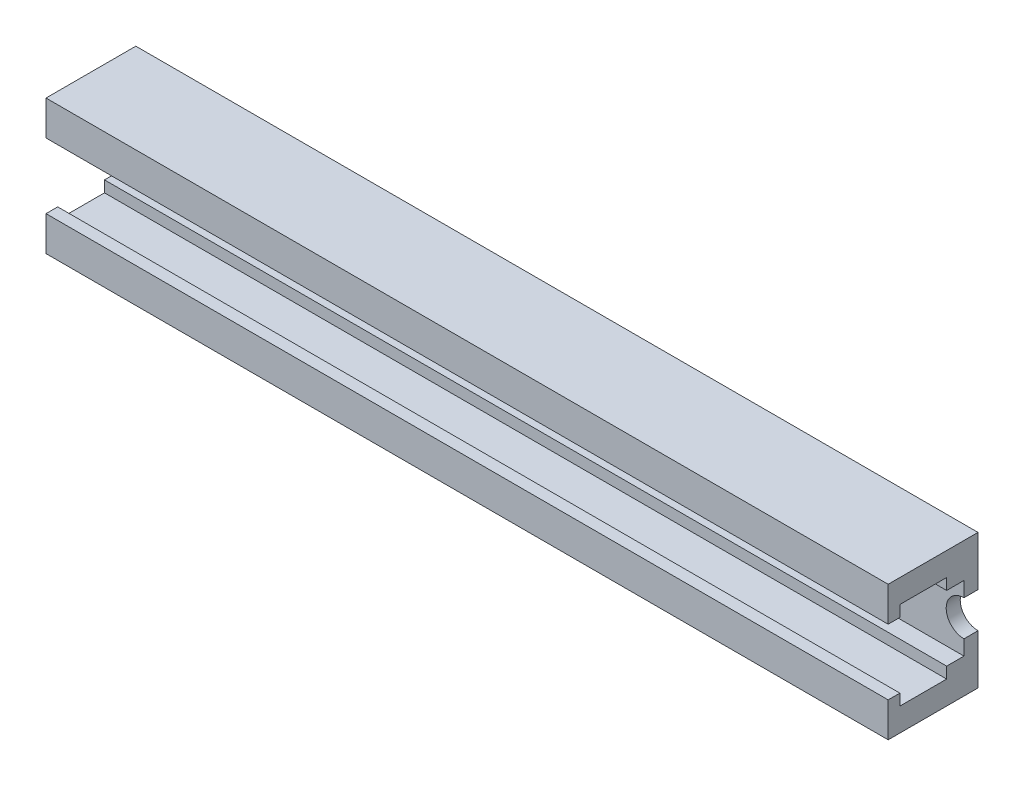
ISO-10303-21;
HEADER;
FILE_DESCRIPTION(('STEP AP214'),'2;1');
FILE_NAME('part.step','',(''),(''),'','','');
FILE_SCHEMA(('AUTOMOTIVE_DESIGN { 1 0 10303 214 1 1 1 1 }'));
ENDSEC;
DATA;
#1=APPLICATION_CONTEXT('core data for automotive mechanical design processes');
#2=APPLICATION_PROTOCOL_DEFINITION('international standard','automotive_design',2000,#1);
#3=PRODUCT_CONTEXT('',#1,'mechanical');
#4=PRODUCT('Part','Part','',(#3));
#5=PRODUCT_RELATED_PRODUCT_CATEGORY('part','',(#4));
#6=PRODUCT_DEFINITION_FORMATION('','',#4);
#7=PRODUCT_DEFINITION_CONTEXT('part definition',#1,'design');
#8=PRODUCT_DEFINITION('design','',#6,#7);
#9=PRODUCT_DEFINITION_SHAPE('','',#8);
#10=(LENGTH_UNIT() NAMED_UNIT(*) SI_UNIT(.MILLI.,.METRE.));
#11=(NAMED_UNIT(*) PLANE_ANGLE_UNIT() SI_UNIT($,.RADIAN.));
#12=(NAMED_UNIT(*) SI_UNIT($,.STERADIAN.) SOLID_ANGLE_UNIT());
#13=UNCERTAINTY_MEASURE_WITH_UNIT(LENGTH_MEASURE(1.E-05),#10,'distance_accuracy_value','');
#14=(GEOMETRIC_REPRESENTATION_CONTEXT(3) GLOBAL_UNCERTAINTY_ASSIGNED_CONTEXT((#13)) GLOBAL_UNIT_ASSIGNED_CONTEXT((#10,
#11,#12)) REPRESENTATION_CONTEXT('',''));
#15=CARTESIAN_POINT('',(0.,0.,0.));
#16=DIRECTION('',(0.,0.,1.));
#17=DIRECTION('',(1.,0.,0.));
#18=AXIS2_PLACEMENT_3D('',#15,#16,#17);
#19=CARTESIAN_POINT('',(228.6,-9.144,0.));
#20=DIRECTION('',(0.,0.,1.));
#21=DIRECTION('',(0.,-1.,0.));
#22=AXIS2_PLACEMENT_3D('',#19,#20,#21);
#23=PLANE('',#22);
#24=CARTESIAN_POINT('',(-190.5,0.,0.));
#25=DIRECTION('',(0.,0.,-1.));
#26=DIRECTION('',(0.,-1.,0.));
#27=AXIS2_PLACEMENT_3D('',#24,#25,#26);
#28=CIRCLE('',#27,2.413);
#29=CARTESIAN_POINT('',(-190.5,-2.413,0.));
#30=VERTEX_POINT('',#29);
#31=EDGE_CURVE('E252',#30,#30,#28,.F.);
#32=ORIENTED_EDGE('',*,*,#31,.T.);
#33=EDGE_LOOP('',(#32));
#34=FACE_BOUND('',#33,.T.);
#35=DIRECTION('',(0.,1.,0.));
#36=VECTOR('',#35,1.);
#37=CARTESIAN_POINT('',(-114.3,-9.144,0.));
#38=LINE('',#37,#36);
#39=CARTESIAN_POINT('',(-114.3,-9.144,0.));
#40=VERTEX_POINT('',#39);
#41=CARTESIAN_POINT('',(-114.3,-2.413,0.));
#42=VERTEX_POINT('',#41);
#43=EDGE_CURVE('E62',#40,#42,#38,.T.);
#44=ORIENTED_EDGE('',*,*,#43,.F.);
#45=DIRECTION('',(-1.,0.,0.));
#46=VECTOR('',#45,1.);
#47=CARTESIAN_POINT('',(228.6,-9.144,0.));
#48=LINE('',#47,#46);
#49=CARTESIAN_POINT('',(-228.6,-9.144,0.));
#50=VERTEX_POINT('',#49);
#51=EDGE_CURVE('E260',#40,#50,#48,.T.);
#52=ORIENTED_EDGE('',*,*,#51,.T.);
#53=DIRECTION('',(0.,1.,0.));
#54=VECTOR('',#53,1.);
#55=CARTESIAN_POINT('',(-228.6,-9.144,0.));
#56=LINE('',#55,#54);
#57=CARTESIAN_POINT('',(-228.6,9.144,0.));
#58=VERTEX_POINT('',#57);
#59=EDGE_CURVE('E182',#50,#58,#56,.T.);
#60=ORIENTED_EDGE('',*,*,#59,.T.);
#61=DIRECTION('',(-1.,0.,0.));
#62=VECTOR('',#61,1.);
#63=CARTESIAN_POINT('',(228.6,9.144,0.));
#64=LINE('',#63,#62);
#65=CARTESIAN_POINT('',(-114.3,9.144,0.));
#66=VERTEX_POINT('',#65);
#67=EDGE_CURVE('E170',#66,#58,#64,.T.);
#68=ORIENTED_EDGE('',*,*,#67,.F.);
#69=CARTESIAN_POINT('',(-114.3,2.413,0.));
#70=VERTEX_POINT('',#69);
#71=EDGE_CURVE('E190',#70,#66,#38,.T.);
#72=ORIENTED_EDGE('',*,*,#71,.F.);
#73=CARTESIAN_POINT('',(-114.3,0.,0.));
#74=DIRECTION('',(0.,0.,-1.));
#75=DIRECTION('',(0.,-1.,0.));
#76=AXIS2_PLACEMENT_3D('',#73,#74,#75);
#77=CIRCLE('',#76,2.413);
#78=EDGE_CURVE('E183',#70,#42,#77,.F.);
#79=ORIENTED_EDGE('',*,*,#78,.T.);
#80=EDGE_LOOP('',(#44,#52,#60,#68,#72,#79));
#81=FACE_BOUND('',#80,.T.);
#82=ADVANCED_FACE('F40',(#34,#81),#23,.F.);
#83=CARTESIAN_POINT('',(228.6,9.144,0.));
#84=DIRECTION('',(0.,-1.,0.));
#85=DIRECTION('',(0.,0.,-1.));
#86=AXIS2_PLACEMENT_3D('',#83,#84,#85);
#87=PLANE('',#86);
#88=DIRECTION('',(0.,0.,1.));
#89=VECTOR('',#88,1.);
#90=CARTESIAN_POINT('',(-114.3,9.144,0.));
#91=LINE('',#90,#89);
#92=CARTESIAN_POINT('',(-114.3,9.144,12.192));
#93=VERTEX_POINT('',#92);
#94=EDGE_CURVE('E311',#66,#93,#91,.T.);
#95=ORIENTED_EDGE('',*,*,#94,.F.);
#96=ORIENTED_EDGE('',*,*,#67,.T.);
#97=DIRECTION('',(0.,0.,1.));
#98=VECTOR('',#97,1.);
#99=CARTESIAN_POINT('',(-228.6,9.144,0.));
#100=LINE('',#99,#98);
#101=CARTESIAN_POINT('',(-228.6,9.144,12.192));
#102=VERTEX_POINT('',#101);
#103=EDGE_CURVE('E188',#58,#102,#100,.T.);
#104=ORIENTED_EDGE('',*,*,#103,.T.);
#105=DIRECTION('',(-1.,0.,0.));
#106=VECTOR('',#105,1.);
#107=CARTESIAN_POINT('',(228.6,9.144,12.192));
#108=LINE('',#107,#106);
#109=EDGE_CURVE('E301',#93,#102,#108,.T.);
#110=ORIENTED_EDGE('',*,*,#109,.F.);
#111=EDGE_LOOP('',(#95,#96,#104,#110));
#112=FACE_BOUND('',#111,.T.);
#113=ADVANCED_FACE('F309',(#112),#87,.F.);
#114=CARTESIAN_POINT('',(228.6,9.144,12.192));
#115=DIRECTION('',(0.,0.,-1.));
#116=DIRECTION('',(0.,1.,0.));
#117=AXIS2_PLACEMENT_3D('',#114,#115,#116);
#118=PLANE('',#117);
#119=DIRECTION('',(0.,-1.,0.));
#120=VECTOR('',#119,1.);
#121=CARTESIAN_POINT('',(-114.3,9.144,12.192));
#122=LINE('',#121,#120);
#123=CARTESIAN_POINT('',(-114.3,4.445,12.192));
#124=VERTEX_POINT('',#123);
#125=EDGE_CURVE('E393',#93,#124,#122,.T.);
#126=ORIENTED_EDGE('',*,*,#125,.F.);
#127=ORIENTED_EDGE('',*,*,#109,.T.);
#128=DIRECTION('',(0.,-1.,0.));
#129=VECTOR('',#128,1.);
#130=CARTESIAN_POINT('',(-228.6,9.144,12.192));
#131=LINE('',#130,#129);
#132=CARTESIAN_POINT('',(-228.6,4.445,12.192));
#133=VERTEX_POINT('',#132);
#134=EDGE_CURVE('E197',#102,#133,#131,.T.);
#135=ORIENTED_EDGE('',*,*,#134,.T.);
#136=DIRECTION('',(-1.,0.,0.));
#137=VECTOR('',#136,1.);
#138=CARTESIAN_POINT('',(228.6,4.445,12.192));
#139=LINE('',#138,#137);
#140=EDGE_CURVE('E298',#124,#133,#139,.T.);
#141=ORIENTED_EDGE('',*,*,#140,.F.);
#142=EDGE_LOOP('',(#126,#127,#135,#141));
#143=FACE_BOUND('',#142,.T.);
#144=ADVANCED_FACE('F392',(#143),#118,.F.);
#145=CARTESIAN_POINT('',(228.6,4.445,12.192));
#146=DIRECTION('',(0.,1.,0.));
#147=DIRECTION('',(0.,0.,1.));
#148=AXIS2_PLACEMENT_3D('',#145,#146,#147);
#149=PLANE('',#148);
#150=DIRECTION('',(0.,0.,-1.));
#151=VECTOR('',#150,1.);
#152=CARTESIAN_POINT('',(-114.3,4.445,12.192));
#153=LINE('',#152,#151);
#154=CARTESIAN_POINT('',(-114.3,4.445,10.6045));
#155=VERTEX_POINT('',#154);
#156=EDGE_CURVE('E388',#124,#155,#153,.T.);
#157=ORIENTED_EDGE('',*,*,#156,.F.);
#158=ORIENTED_EDGE('',*,*,#140,.T.);
#159=DIRECTION('',(0.,0.,-1.));
#160=VECTOR('',#159,1.);
#161=CARTESIAN_POINT('',(-228.6,4.445,12.192));
#162=LINE('',#161,#160);
#163=CARTESIAN_POINT('',(-228.6,4.445,10.6045));
#164=VERTEX_POINT('',#163);
#165=EDGE_CURVE('E201',#133,#164,#162,.T.);
#166=ORIENTED_EDGE('',*,*,#165,.T.);
#167=DIRECTION('',(-1.,0.,0.));
#168=VECTOR('',#167,1.);
#169=CARTESIAN_POINT('',(228.6,4.445,10.6045));
#170=LINE('',#169,#168);
#171=EDGE_CURVE('E295',#155,#164,#170,.T.);
#172=ORIENTED_EDGE('',*,*,#171,.F.);
#173=EDGE_LOOP('',(#157,#158,#166,#172));
#174=FACE_BOUND('',#173,.T.);
#175=ADVANCED_FACE('F387',(#174),#149,.F.);
#176=CARTESIAN_POINT('',(228.6,4.445,10.6045));
#177=DIRECTION('',(0.,0.,1.));
#178=DIRECTION('',(1.,0.,0.));
#179=AXIS2_PLACEMENT_3D('',#176,#177,#178);
#180=PLANE('',#179);
#181=DIRECTION('',(0.,1.,0.));
#182=VECTOR('',#181,1.);
#183=CARTESIAN_POINT('',(-114.3,4.445,10.6045));
#184=LINE('',#183,#182);
#185=CARTESIAN_POINT('',(-114.3,5.969,10.6045));
#186=VERTEX_POINT('',#185);
#187=EDGE_CURVE('E384',#155,#186,#184,.T.);
#188=ORIENTED_EDGE('',*,*,#187,.F.);
#189=ORIENTED_EDGE('',*,*,#171,.T.);
#190=DIRECTION('',(0.,1.,0.));
#191=VECTOR('',#190,1.);
#192=CARTESIAN_POINT('',(-228.6,4.445,10.6045));
#193=LINE('',#192,#191);
#194=CARTESIAN_POINT('',(-228.6,5.969,10.6045));
#195=VERTEX_POINT('',#194);
#196=EDGE_CURVE('E205',#164,#195,#193,.T.);
#197=ORIENTED_EDGE('',*,*,#196,.T.);
#198=DIRECTION('',(-1.,0.,0.));
#199=VECTOR('',#198,1.);
#200=CARTESIAN_POINT('',(228.6,5.969,10.6045));
#201=LINE('',#200,#199);
#202=EDGE_CURVE('E292',#186,#195,#201,.T.);
#203=ORIENTED_EDGE('',*,*,#202,.F.);
#204=EDGE_LOOP('',(#188,#189,#197,#203));
#205=FACE_BOUND('',#204,.T.);
#206=ADVANCED_FACE('F382',(#205),#180,.F.);
#207=CARTESIAN_POINT('',(228.6,5.969,10.6045));
#208=DIRECTION('',(0.,1.,0.));
#209=DIRECTION('',(0.,0.,1.));
#210=AXIS2_PLACEMENT_3D('',#207,#208,#209);
#211=PLANE('',#210);
#212=DIRECTION('',(0.,0.,-1.));
#213=VECTOR('',#212,1.);
#214=CARTESIAN_POINT('',(-114.3,5.969,10.6045));
#215=LINE('',#214,#213);
#216=CARTESIAN_POINT('',(-114.3,5.969,4.2545));
#217=VERTEX_POINT('',#216);
#218=EDGE_CURVE('E377',#186,#217,#215,.T.);
#219=ORIENTED_EDGE('',*,*,#218,.F.);
#220=ORIENTED_EDGE('',*,*,#202,.T.);
#221=DIRECTION('',(0.,0.,-1.));
#222=VECTOR('',#221,1.);
#223=CARTESIAN_POINT('',(-228.6,5.969,10.6045));
#224=LINE('',#223,#222);
#225=CARTESIAN_POINT('',(-228.6,5.969,4.2545));
#226=VERTEX_POINT('',#225);
#227=EDGE_CURVE('E209',#195,#226,#224,.T.);
#228=ORIENTED_EDGE('',*,*,#227,.T.);
#229=DIRECTION('',(-1.,0.,0.));
#230=VECTOR('',#229,1.);
#231=CARTESIAN_POINT('',(228.6,5.969,4.2545));
#232=LINE('',#231,#230);
#233=EDGE_CURVE('E289',#217,#226,#232,.T.);
#234=ORIENTED_EDGE('',*,*,#233,.F.);
#235=EDGE_LOOP('',(#219,#220,#228,#234));
#236=FACE_BOUND('',#235,.T.);
#237=ADVANCED_FACE('F376',(#236),#211,.F.);
#238=CARTESIAN_POINT('',(228.6,5.969,4.2545));
#239=DIRECTION('',(0.,0.,-1.));
#240=DIRECTION('',(-1.,0.,0.));
#241=AXIS2_PLACEMENT_3D('',#238,#239,#240);
#242=PLANE('',#241);
#243=DIRECTION('',(0.,-1.,0.));
#244=VECTOR('',#243,1.);
#245=CARTESIAN_POINT('',(-114.3,5.969,4.2545));
#246=LINE('',#245,#244);
#247=CARTESIAN_POINT('',(-114.3,4.445,4.2545));
#248=VERTEX_POINT('',#247);
#249=EDGE_CURVE('E373',#217,#248,#246,.T.);
#250=ORIENTED_EDGE('',*,*,#249,.F.);
#251=ORIENTED_EDGE('',*,*,#233,.T.);
#252=DIRECTION('',(0.,-1.,0.));
#253=VECTOR('',#252,1.);
#254=CARTESIAN_POINT('',(-228.6,5.969,4.2545));
#255=LINE('',#254,#253);
#256=CARTESIAN_POINT('',(-228.6,4.445,4.2545));
#257=VERTEX_POINT('',#256);
#258=EDGE_CURVE('E213',#226,#257,#255,.T.);
#259=ORIENTED_EDGE('',*,*,#258,.T.);
#260=DIRECTION('',(-1.,0.,0.));
#261=VECTOR('',#260,1.);
#262=CARTESIAN_POINT('',(228.6,4.445,4.2545));
#263=LINE('',#262,#261);
#264=EDGE_CURVE('E286',#248,#257,#263,.T.);
#265=ORIENTED_EDGE('',*,*,#264,.F.);
#266=EDGE_LOOP('',(#250,#251,#259,#265));
#267=FACE_BOUND('',#266,.T.);
#268=ADVANCED_FACE('F371',(#267),#242,.F.);
#269=CARTESIAN_POINT('',(228.6,4.445,4.2545));
#270=DIRECTION('',(0.,1.,0.));
#271=DIRECTION('',(0.,0.,1.));
#272=AXIS2_PLACEMENT_3D('',#269,#270,#271);
#273=PLANE('',#272);
#274=DIRECTION('',(0.,0.,-1.));
#275=VECTOR('',#274,1.);
#276=CARTESIAN_POINT('',(-114.3,4.445,4.2545));
#277=LINE('',#276,#275);
#278=CARTESIAN_POINT('',(-114.3,4.445,1.905));
#279=VERTEX_POINT('',#278);
#280=EDGE_CURVE('E365',#248,#279,#277,.T.);
#281=ORIENTED_EDGE('',*,*,#280,.F.);
#282=ORIENTED_EDGE('',*,*,#264,.T.);
#283=DIRECTION('',(0.,0.,-1.));
#284=VECTOR('',#283,1.);
#285=CARTESIAN_POINT('',(-228.6,4.445,4.2545));
#286=LINE('',#285,#284);
#287=CARTESIAN_POINT('',(-228.6,4.445,1.905));
#288=VERTEX_POINT('',#287);
#289=EDGE_CURVE('E217',#257,#288,#286,.T.);
#290=ORIENTED_EDGE('',*,*,#289,.T.);
#291=DIRECTION('',(-1.,0.,0.));
#292=VECTOR('',#291,1.);
#293=CARTESIAN_POINT('',(228.6,4.445,1.905));
#294=LINE('',#293,#292);
#295=EDGE_CURVE('E283',#279,#288,#294,.T.);
#296=ORIENTED_EDGE('',*,*,#295,.F.);
#297=EDGE_LOOP('',(#281,#282,#290,#296));
#298=FACE_BOUND('',#297,.T.);
#299=ADVANCED_FACE('F364',(#298),#273,.F.);
#300=CARTESIAN_POINT('',(228.6,4.445,1.905));
#301=DIRECTION('',(0.,0.,-1.));
#302=DIRECTION('',(0.,1.,0.));
#303=AXIS2_PLACEMENT_3D('',#300,#301,#302);
#304=PLANE('',#303);
#305=CARTESIAN_POINT('',(-190.5,0.,1.905));
#306=DIRECTION('',(0.,0.,-1.));
#307=DIRECTION('',(-1.,0.,0.));
#308=AXIS2_PLACEMENT_3D('',#305,#306,#307);
#309=CIRCLE('',#308,2.413);
#310=CARTESIAN_POINT('',(-192.913,0.,1.905));
#311=VERTEX_POINT('',#310);
#312=EDGE_CURVE('E256',#311,#311,#309,.T.);
#313=ORIENTED_EDGE('',*,*,#312,.T.);
#314=EDGE_LOOP('',(#313));
#315=FACE_BOUND('',#314,.T.);
#316=DIRECTION('',(0.,-1.,0.));
#317=VECTOR('',#316,1.);
#318=CARTESIAN_POINT('',(-114.3,4.445,1.905));
#319=LINE('',#318,#317);
#320=CARTESIAN_POINT('',(-114.3,2.413,1.905));
#321=VERTEX_POINT('',#320);
#322=EDGE_CURVE('E54',#279,#321,#319,.T.);
#323=ORIENTED_EDGE('',*,*,#322,.F.);
#324=ORIENTED_EDGE('',*,*,#295,.T.);
#325=DIRECTION('',(0.,-1.,0.));
#326=VECTOR('',#325,1.);
#327=CARTESIAN_POINT('',(-228.6,4.445,1.905));
#328=LINE('',#327,#326);
#329=CARTESIAN_POINT('',(-228.6,-4.445,1.905));
#330=VERTEX_POINT('',#329);
#331=EDGE_CURVE('E221',#288,#330,#328,.T.);
#332=ORIENTED_EDGE('',*,*,#331,.T.);
#333=DIRECTION('',(-1.,0.,0.));
#334=VECTOR('',#333,1.);
#335=CARTESIAN_POINT('',(228.6,-4.445,1.905));
#336=LINE('',#335,#334);
#337=CARTESIAN_POINT('',(-114.3,-4.445,1.905));
#338=VERTEX_POINT('',#337);
#339=EDGE_CURVE('E177',#338,#330,#336,.T.);
#340=ORIENTED_EDGE('',*,*,#339,.F.);
#341=CARTESIAN_POINT('',(-114.3,-2.413,1.905));
#342=VERTEX_POINT('',#341);
#343=EDGE_CURVE('E163',#342,#338,#319,.T.);
#344=ORIENTED_EDGE('',*,*,#343,.F.);
#345=CARTESIAN_POINT('',(-114.3,0.,1.905));
#346=DIRECTION('',(0.,0.,-1.));
#347=DIRECTION('',(-1.,0.,0.));
#348=AXIS2_PLACEMENT_3D('',#345,#346,#347);
#349=CIRCLE('',#348,2.413);
#350=EDGE_CURVE('E175',#342,#321,#349,.T.);
#351=ORIENTED_EDGE('',*,*,#350,.T.);
#352=EDGE_LOOP('',(#323,#324,#332,#340,#344,#351));
#353=FACE_BOUND('',#352,.T.);
#354=ADVANCED_FACE('F174',(#315,#353),#304,.F.);
#355=CARTESIAN_POINT('',(228.6,-4.445,1.905));
#356=DIRECTION('',(0.,-1.,0.));
#357=DIRECTION('',(0.,0.,-1.));
#358=AXIS2_PLACEMENT_3D('',#355,#356,#357);
#359=PLANE('',#358);
#360=DIRECTION('',(0.,0.,1.));
#361=VECTOR('',#360,1.);
#362=CARTESIAN_POINT('',(-114.3,-4.445,1.905));
#363=LINE('',#362,#361);
#364=CARTESIAN_POINT('',(-114.3,-4.445,4.2545));
#365=VERTEX_POINT('',#364);
#366=EDGE_CURVE('E358',#338,#365,#363,.T.);
#367=ORIENTED_EDGE('',*,*,#366,.F.);
#368=ORIENTED_EDGE('',*,*,#339,.T.);
#369=DIRECTION('',(0.,0.,1.));
#370=VECTOR('',#369,1.);
#371=CARTESIAN_POINT('',(-228.6,-4.445,1.905));
#372=LINE('',#371,#370);
#373=CARTESIAN_POINT('',(-228.6,-4.445,4.2545));
#374=VERTEX_POINT('',#373);
#375=EDGE_CURVE('E224',#330,#374,#372,.T.);
#376=ORIENTED_EDGE('',*,*,#375,.T.);
#377=DIRECTION('',(-1.,0.,0.));
#378=VECTOR('',#377,1.);
#379=CARTESIAN_POINT('',(228.6,-4.445,4.2545));
#380=LINE('',#379,#378);
#381=EDGE_CURVE('E278',#365,#374,#380,.T.);
#382=ORIENTED_EDGE('',*,*,#381,.F.);
#383=EDGE_LOOP('',(#367,#368,#376,#382));
#384=FACE_BOUND('',#383,.T.);
#385=ADVANCED_FACE('F357',(#384),#359,.F.);
#386=CARTESIAN_POINT('',(228.6,-4.445,4.2545));
#387=DIRECTION('',(0.,0.,-1.));
#388=DIRECTION('',(0.,1.,0.));
#389=AXIS2_PLACEMENT_3D('',#386,#387,#388);
#390=PLANE('',#389);
#391=DIRECTION('',(0.,-1.,0.));
#392=VECTOR('',#391,1.);
#393=CARTESIAN_POINT('',(-114.3,-4.445,4.2545));
#394=LINE('',#393,#392);
#395=CARTESIAN_POINT('',(-114.3,-5.969,4.2545));
#396=VERTEX_POINT('',#395);
#397=EDGE_CURVE('E355',#365,#396,#394,.T.);
#398=ORIENTED_EDGE('',*,*,#397,.F.);
#399=ORIENTED_EDGE('',*,*,#381,.T.);
#400=DIRECTION('',(0.,-1.,0.));
#401=VECTOR('',#400,1.);
#402=CARTESIAN_POINT('',(-228.6,-4.445,4.2545));
#403=LINE('',#402,#401);
#404=CARTESIAN_POINT('',(-228.6,-5.969,4.2545));
#405=VERTEX_POINT('',#404);
#406=EDGE_CURVE('E228',#374,#405,#403,.T.);
#407=ORIENTED_EDGE('',*,*,#406,.T.);
#408=DIRECTION('',(-1.,0.,0.));
#409=VECTOR('',#408,1.);
#410=CARTESIAN_POINT('',(228.6,-5.969,4.2545));
#411=LINE('',#410,#409);
#412=EDGE_CURVE('E275',#396,#405,#411,.T.);
#413=ORIENTED_EDGE('',*,*,#412,.F.);
#414=EDGE_LOOP('',(#398,#399,#407,#413));
#415=FACE_BOUND('',#414,.T.);
#416=ADVANCED_FACE('F353',(#415),#390,.F.);
#417=CARTESIAN_POINT('',(228.6,-5.969,4.2545));
#418=DIRECTION('',(0.,-1.,0.));
#419=DIRECTION('',(0.,0.,-1.));
#420=AXIS2_PLACEMENT_3D('',#417,#418,#419);
#421=PLANE('',#420);
#422=DIRECTION('',(0.,0.,1.));
#423=VECTOR('',#422,1.);
#424=CARTESIAN_POINT('',(-114.3,-5.969,4.2545));
#425=LINE('',#424,#423);
#426=CARTESIAN_POINT('',(-114.3,-5.969,10.6045));
#427=VERTEX_POINT('',#426);
#428=EDGE_CURVE('E347',#396,#427,#425,.T.);
#429=ORIENTED_EDGE('',*,*,#428,.F.);
#430=ORIENTED_EDGE('',*,*,#412,.T.);
#431=DIRECTION('',(0.,0.,1.));
#432=VECTOR('',#431,1.);
#433=CARTESIAN_POINT('',(-228.6,-5.969,4.2545));
#434=LINE('',#433,#432);
#435=CARTESIAN_POINT('',(-228.6,-5.969,10.6045));
#436=VERTEX_POINT('',#435);
#437=EDGE_CURVE('E232',#405,#436,#434,.T.);
#438=ORIENTED_EDGE('',*,*,#437,.T.);
#439=DIRECTION('',(-1.,0.,0.));
#440=VECTOR('',#439,1.);
#441=CARTESIAN_POINT('',(228.6,-5.969,10.6045));
#442=LINE('',#441,#440);
#443=EDGE_CURVE('E272',#427,#436,#442,.T.);
#444=ORIENTED_EDGE('',*,*,#443,.F.);
#445=EDGE_LOOP('',(#429,#430,#438,#444));
#446=FACE_BOUND('',#445,.T.);
#447=ADVANCED_FACE('F346',(#446),#421,.F.);
#448=CARTESIAN_POINT('',(228.6,-5.969,10.6045));
#449=DIRECTION('',(0.,0.,1.));
#450=DIRECTION('',(1.,0.,0.));
#451=AXIS2_PLACEMENT_3D('',#448,#449,#450);
#452=PLANE('',#451);
#453=DIRECTION('',(0.,1.,0.));
#454=VECTOR('',#453,1.);
#455=CARTESIAN_POINT('',(-114.3,-5.969,10.6045));
#456=LINE('',#455,#454);
#457=CARTESIAN_POINT('',(-114.3,-4.445,10.6045));
#458=VERTEX_POINT('',#457);
#459=EDGE_CURVE('E343',#427,#458,#456,.T.);
#460=ORIENTED_EDGE('',*,*,#459,.F.);
#461=ORIENTED_EDGE('',*,*,#443,.T.);
#462=DIRECTION('',(0.,1.,0.));
#463=VECTOR('',#462,1.);
#464=CARTESIAN_POINT('',(-228.6,-5.969,10.6045));
#465=LINE('',#464,#463);
#466=CARTESIAN_POINT('',(-228.6,-4.445,10.6045));
#467=VERTEX_POINT('',#466);
#468=EDGE_CURVE('E236',#436,#467,#465,.T.);
#469=ORIENTED_EDGE('',*,*,#468,.T.);
#470=DIRECTION('',(-1.,0.,0.));
#471=VECTOR('',#470,1.);
#472=CARTESIAN_POINT('',(228.6,-4.445,10.6045));
#473=LINE('',#472,#471);
#474=EDGE_CURVE('E269',#458,#467,#473,.T.);
#475=ORIENTED_EDGE('',*,*,#474,.F.);
#476=EDGE_LOOP('',(#460,#461,#469,#475));
#477=FACE_BOUND('',#476,.T.);
#478=ADVANCED_FACE('F341',(#477),#452,.F.);
#479=CARTESIAN_POINT('',(228.6,-4.445,10.6045));
#480=DIRECTION('',(0.,-1.,0.));
#481=DIRECTION('',(0.,0.,-1.));
#482=AXIS2_PLACEMENT_3D('',#479,#480,#481);
#483=PLANE('',#482);
#484=DIRECTION('',(0.,0.,1.));
#485=VECTOR('',#484,1.);
#486=CARTESIAN_POINT('',(-114.3,-4.445,10.6045));
#487=LINE('',#486,#485);
#488=CARTESIAN_POINT('',(-114.3,-4.445,12.192));
#489=VERTEX_POINT('',#488);
#490=EDGE_CURVE('E335',#458,#489,#487,.T.);
#491=ORIENTED_EDGE('',*,*,#490,.F.);
#492=ORIENTED_EDGE('',*,*,#474,.T.);
#493=DIRECTION('',(0.,0.,1.));
#494=VECTOR('',#493,1.);
#495=CARTESIAN_POINT('',(-228.6,-4.445,10.6045));
#496=LINE('',#495,#494);
#497=CARTESIAN_POINT('',(-228.6,-4.445,12.192));
#498=VERTEX_POINT('',#497);
#499=EDGE_CURVE('E240',#467,#498,#496,.T.);
#500=ORIENTED_EDGE('',*,*,#499,.T.);
#501=DIRECTION('',(-1.,0.,0.));
#502=VECTOR('',#501,1.);
#503=CARTESIAN_POINT('',(228.6,-4.445,12.192));
#504=LINE('',#503,#502);
#505=EDGE_CURVE('E266',#489,#498,#504,.T.);
#506=ORIENTED_EDGE('',*,*,#505,.F.);
#507=EDGE_LOOP('',(#491,#492,#500,#506));
#508=FACE_BOUND('',#507,.T.);
#509=ADVANCED_FACE('F334',(#508),#483,.F.);
#510=CARTESIAN_POINT('',(228.6,-4.445,12.192));
#511=DIRECTION('',(0.,0.,-1.));
#512=DIRECTION('',(0.,1.,0.));
#513=AXIS2_PLACEMENT_3D('',#510,#511,#512);
#514=PLANE('',#513);
#515=DIRECTION('',(0.,-1.,0.));
#516=VECTOR('',#515,1.);
#517=CARTESIAN_POINT('',(-114.3,-4.445,12.192));
#518=LINE('',#517,#516);
#519=CARTESIAN_POINT('',(-114.3,-9.14400000000001,12.192));
#520=VERTEX_POINT('',#519);
#521=EDGE_CURVE('E331',#489,#520,#518,.T.);
#522=ORIENTED_EDGE('',*,*,#521,.F.);
#523=ORIENTED_EDGE('',*,*,#505,.T.);
#524=DIRECTION('',(0.,-1.,0.));
#525=VECTOR('',#524,1.);
#526=CARTESIAN_POINT('',(-228.6,-4.445,12.192));
#527=LINE('',#526,#525);
#528=CARTESIAN_POINT('',(-228.6,-9.14400000000001,12.192));
#529=VERTEX_POINT('',#528);
#530=EDGE_CURVE('E244',#498,#529,#527,.T.);
#531=ORIENTED_EDGE('',*,*,#530,.T.);
#532=DIRECTION('',(-1.,0.,0.));
#533=VECTOR('',#532,1.);
#534=CARTESIAN_POINT('',(228.6,-9.14400000000001,12.192));
#535=LINE('',#534,#533);
#536=EDGE_CURVE('E263',#520,#529,#535,.T.);
#537=ORIENTED_EDGE('',*,*,#536,.F.);
#538=EDGE_LOOP('',(#522,#523,#531,#537));
#539=FACE_BOUND('',#538,.T.);
#540=ADVANCED_FACE('F329',(#539),#514,.F.);
#541=CARTESIAN_POINT('',(228.6,-9.14400000000001,12.192));
#542=DIRECTION('',(0.,1.,0.));
#543=DIRECTION('',(0.,0.,1.));
#544=AXIS2_PLACEMENT_3D('',#541,#542,#543);
#545=PLANE('',#544);
#546=DIRECTION('',(0.,0.,-1.));
#547=VECTOR('',#546,1.);
#548=CARTESIAN_POINT('',(-114.3,-9.14400000000001,12.192));
#549=LINE('',#548,#547);
#550=EDGE_CURVE('E420',#520,#40,#549,.T.);
#551=ORIENTED_EDGE('',*,*,#550,.F.);
#552=ORIENTED_EDGE('',*,*,#536,.T.);
#553=DIRECTION('',(0.,0.,-1.));
#554=VECTOR('',#553,1.);
#555=CARTESIAN_POINT('',(-228.6,-9.14400000000001,12.192));
#556=LINE('',#555,#554);
#557=EDGE_CURVE('E248',#529,#50,#556,.T.);
#558=ORIENTED_EDGE('',*,*,#557,.T.);
#559=ORIENTED_EDGE('',*,*,#51,.F.);
#560=EDGE_LOOP('',(#551,#552,#558,#559));
#561=FACE_BOUND('',#560,.T.);
#562=ADVANCED_FACE('F323',(#561),#545,.F.);
#563=CARTESIAN_POINT('',(-114.3,0.,-6.82499465201257));
#564=DIRECTION('',(0.,0.,1.));
#565=DIRECTION('',(-1.,0.,0.));
#566=AXIS2_PLACEMENT_3D('',#563,#564,#565);
#567=CYLINDRICAL_SURFACE('',#566,2.413);
#568=DIRECTION('',(0.,0.,1.));
#569=VECTOR('',#568,1.);
#570=CARTESIAN_POINT('',(-114.3,2.413,-6.82499465201257));
#571=LINE('',#570,#569);
#572=EDGE_CURVE('E12',#321,#70,#571,.F.);
#573=ORIENTED_EDGE('',*,*,#572,.F.);
#574=ORIENTED_EDGE('',*,*,#350,.F.);
#575=DIRECTION('',(0.,0.,1.));
#576=VECTOR('',#575,1.);
#577=CARTESIAN_POINT('',(-114.3,-2.413,-6.82499465201257));
#578=LINE('',#577,#576);
#579=EDGE_CURVE('E48',#42,#342,#578,.T.);
#580=ORIENTED_EDGE('',*,*,#579,.F.);
#581=ORIENTED_EDGE('',*,*,#78,.F.);
#582=EDGE_LOOP('',(#573,#574,#580,#581));
#583=FACE_BOUND('',#582,.T.);
#584=ADVANCED_FACE('F180',(#583),#567,.F.);
#585=CARTESIAN_POINT('',(-228.6,9.144,0.));
#586=DIRECTION('',(-1.,0.,0.));
#587=DIRECTION('',(0.,0.,-1.));
#588=AXIS2_PLACEMENT_3D('',#585,#586,#587);
#589=PLANE('',#588);
#590=ORIENTED_EDGE('',*,*,#59,.F.);
#591=ORIENTED_EDGE('',*,*,#557,.F.);
#592=ORIENTED_EDGE('',*,*,#530,.F.);
#593=ORIENTED_EDGE('',*,*,#499,.F.);
#594=ORIENTED_EDGE('',*,*,#468,.F.);
#595=ORIENTED_EDGE('',*,*,#437,.F.);
#596=ORIENTED_EDGE('',*,*,#406,.F.);
#597=ORIENTED_EDGE('',*,*,#375,.F.);
#598=ORIENTED_EDGE('',*,*,#331,.F.);
#599=ORIENTED_EDGE('',*,*,#289,.F.);
#600=ORIENTED_EDGE('',*,*,#258,.F.);
#601=ORIENTED_EDGE('',*,*,#227,.F.);
#602=ORIENTED_EDGE('',*,*,#196,.F.);
#603=ORIENTED_EDGE('',*,*,#165,.F.);
#604=ORIENTED_EDGE('',*,*,#134,.F.);
#605=ORIENTED_EDGE('',*,*,#103,.F.);
#606=EDGE_LOOP('',(#590,#591,#592,#593,#594,#595,#596,#597,#598,#599,#600,#601,#602,#603,#604,#605));
#607=FACE_BOUND('',#606,.T.);
#608=ADVANCED_FACE('F317',(#607),#589,.T.);
#609=CARTESIAN_POINT('',(-190.5,0.,-6.82499465201257));
#610=DIRECTION('',(0.,0.,1.));
#611=DIRECTION('',(-1.,0.,0.));
#612=AXIS2_PLACEMENT_3D('',#609,#610,#611);
#613=CYLINDRICAL_SURFACE('',#612,2.413);
#614=ORIENTED_EDGE('',*,*,#31,.F.);
#615=EDGE_LOOP('',(#614));
#616=FACE_BOUND('',#615,.T.);
#617=ORIENTED_EDGE('',*,*,#312,.F.);
#618=EDGE_LOOP('',(#617));
#619=FACE_BOUND('',#618,.T.);
#620=ADVANCED_FACE('F431',(#616,#619),#613,.F.);
#621=CARTESIAN_POINT('',(-114.3,0.,0.));
#622=DIRECTION('',(1.,0.,0.));
#623=DIRECTION('',(0.,0.,-1.));
#624=AXIS2_PLACEMENT_3D('',#621,#622,#623);
#625=PLANE('',#624);
#626=ORIENTED_EDGE('',*,*,#366,.T.);
#627=ORIENTED_EDGE('',*,*,#397,.T.);
#628=ORIENTED_EDGE('',*,*,#428,.T.);
#629=ORIENTED_EDGE('',*,*,#459,.T.);
#630=ORIENTED_EDGE('',*,*,#490,.T.);
#631=ORIENTED_EDGE('',*,*,#521,.T.);
#632=ORIENTED_EDGE('',*,*,#550,.T.);
#633=ORIENTED_EDGE('',*,*,#43,.T.);
#634=ORIENTED_EDGE('',*,*,#579,.T.);
#635=ORIENTED_EDGE('',*,*,#343,.T.);
#636=EDGE_LOOP('',(#626,#627,#628,#629,#630,#631,#632,#633,#634,#635));
#637=FACE_BOUND('',#636,.T.);
#638=ADVANCED_FACE('F162',(#637),#625,.T.);
#639=ORIENTED_EDGE('',*,*,#71,.T.);
#640=ORIENTED_EDGE('',*,*,#94,.T.);
#641=ORIENTED_EDGE('',*,*,#125,.T.);
#642=ORIENTED_EDGE('',*,*,#156,.T.);
#643=ORIENTED_EDGE('',*,*,#187,.T.);
#644=ORIENTED_EDGE('',*,*,#218,.T.);
#645=ORIENTED_EDGE('',*,*,#249,.T.);
#646=ORIENTED_EDGE('',*,*,#280,.T.);
#647=ORIENTED_EDGE('',*,*,#322,.T.);
#648=ORIENTED_EDGE('',*,*,#572,.T.);
#649=EDGE_LOOP('',(#639,#640,#641,#642,#643,#644,#645,#646,#647,#648));
#650=FACE_BOUND('',#649,.T.);
#651=ADVANCED_FACE('F425',(#650),#625,.T.);
#652=CLOSED_SHELL('',(#82,#113,#144,#175,#206,#237,#268,#299,#354,#385,#416,#447,#478,#509,#540,
#562,#584,#608,#620,#638,#651));
#653=MANIFOLD_SOLID_BREP('B2',#652);
#654=ADVANCED_BREP_SHAPE_REPRESENTATION('',(#18,#653),#14);
#655=SHAPE_DEFINITION_REPRESENTATION(#9,#654);
ENDSEC;
END-ISO-10303-21;
